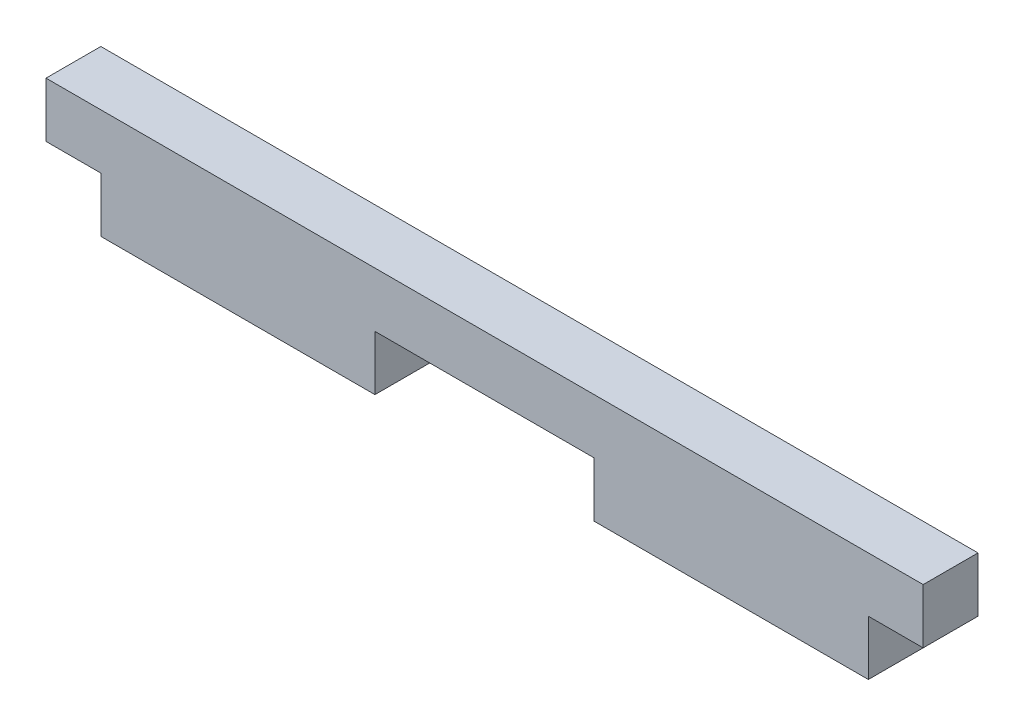
ISO-10303-21;
HEADER;
FILE_DESCRIPTION(('STEP AP214'),'2;1');
FILE_NAME('part.step','',(''),(''),'','','');
FILE_SCHEMA(('AUTOMOTIVE_DESIGN { 1 0 10303 214 1 1 1 1 }'));
ENDSEC;
DATA;
#1=APPLICATION_CONTEXT('core data for automotive mechanical design processes');
#2=APPLICATION_PROTOCOL_DEFINITION('international standard','automotive_design',2000,#1);
#3=PRODUCT_CONTEXT('',#1,'mechanical');
#4=PRODUCT('Part','Part','',(#3));
#5=PRODUCT_RELATED_PRODUCT_CATEGORY('part','',(#4));
#6=PRODUCT_DEFINITION_FORMATION('','',#4);
#7=PRODUCT_DEFINITION_CONTEXT('part definition',#1,'design');
#8=PRODUCT_DEFINITION('design','',#6,#7);
#9=PRODUCT_DEFINITION_SHAPE('','',#8);
#10=(LENGTH_UNIT() NAMED_UNIT(*) SI_UNIT(.MILLI.,.METRE.));
#11=(NAMED_UNIT(*) PLANE_ANGLE_UNIT() SI_UNIT($,.RADIAN.));
#12=(NAMED_UNIT(*) SI_UNIT($,.STERADIAN.) SOLID_ANGLE_UNIT());
#13=UNCERTAINTY_MEASURE_WITH_UNIT(LENGTH_MEASURE(1.E-05),#10,'distance_accuracy_value','');
#14=(GEOMETRIC_REPRESENTATION_CONTEXT(3) GLOBAL_UNCERTAINTY_ASSIGNED_CONTEXT((#13)) GLOBAL_UNIT_ASSIGNED_CONTEXT((#10,
#11,#12)) REPRESENTATION_CONTEXT('',''));
#15=CARTESIAN_POINT('',(0.,0.,0.));
#16=DIRECTION('',(0.,0.,1.));
#17=DIRECTION('',(1.,0.,0.));
#18=AXIS2_PLACEMENT_3D('',#15,#16,#17);
#19=CARTESIAN_POINT('',(0.,0.,5.));
#20=DIRECTION('',(1.,0.,0.));
#21=DIRECTION('',(0.,0.,-1.));
#22=AXIS2_PLACEMENT_3D('',#19,#20,#21);
#23=PLANE('',#22);
#24=DIRECTION('',(0.,-1.,0.));
#25=VECTOR('',#24,1.);
#26=CARTESIAN_POINT('',(0.,0.,0.));
#27=LINE('',#26,#25);
#28=CARTESIAN_POINT('',(0.,5.,0.));
#29=VERTEX_POINT('',#28);
#30=CARTESIAN_POINT('',(0.,0.,0.));
#31=VERTEX_POINT('',#30);
#32=EDGE_CURVE('E155',#29,#31,#27,.T.);
#33=ORIENTED_EDGE('',*,*,#32,.T.);
#34=DIRECTION('',(0.,0.,-1.));
#35=VECTOR('',#34,1.);
#36=CARTESIAN_POINT('',(0.,0.,5.));
#37=LINE('',#36,#35);
#38=CARTESIAN_POINT('',(0.,0.,5.));
#39=VERTEX_POINT('',#38);
#40=EDGE_CURVE('E11',#39,#31,#37,.T.);
#41=ORIENTED_EDGE('',*,*,#40,.F.);
#42=DIRECTION('',(0.,-1.,0.));
#43=VECTOR('',#42,1.);
#44=CARTESIAN_POINT('',(0.,0.,5.));
#45=LINE('',#44,#43);
#46=CARTESIAN_POINT('',(0.,5.,5.));
#47=VERTEX_POINT('',#46);
#48=EDGE_CURVE('E177',#47,#39,#45,.T.);
#49=ORIENTED_EDGE('',*,*,#48,.F.);
#50=DIRECTION('',(0.,0.,-1.));
#51=VECTOR('',#50,1.);
#52=CARTESIAN_POINT('',(0.,5.,5.));
#53=LINE('',#52,#51);
#54=EDGE_CURVE('E151',#47,#29,#53,.T.);
#55=ORIENTED_EDGE('',*,*,#54,.T.);
#56=EDGE_LOOP('',(#33,#41,#49,#55));
#57=FACE_BOUND('',#56,.T.);
#58=ADVANCED_FACE('F35',(#57),#23,.F.);
#59=CARTESIAN_POINT('',(0.,0.,5.));
#60=DIRECTION('',(0.,1.,0.));
#61=DIRECTION('',(0.,0.,1.));
#62=AXIS2_PLACEMENT_3D('',#59,#60,#61);
#63=PLANE('',#62);
#64=DIRECTION('',(1.,0.,0.));
#65=VECTOR('',#64,1.);
#66=CARTESIAN_POINT('',(0.,0.,0.));
#67=LINE('',#66,#65);
#68=CARTESIAN_POINT('',(5.,0.,0.));
#69=VERTEX_POINT('',#68);
#70=EDGE_CURVE('E158',#31,#69,#67,.T.);
#71=ORIENTED_EDGE('',*,*,#70,.T.);
#72=DIRECTION('',(0.,0.,-1.));
#73=VECTOR('',#72,1.);
#74=CARTESIAN_POINT('',(5.,0.,5.));
#75=LINE('',#74,#73);
#76=CARTESIAN_POINT('',(5.,0.,5.));
#77=VERTEX_POINT('',#76);
#78=EDGE_CURVE('E43',#77,#69,#75,.T.);
#79=ORIENTED_EDGE('',*,*,#78,.F.);
#80=DIRECTION('',(1.,0.,0.));
#81=VECTOR('',#80,1.);
#82=CARTESIAN_POINT('',(0.,0.,5.));
#83=LINE('',#82,#81);
#84=EDGE_CURVE('E106',#39,#77,#83,.T.);
#85=ORIENTED_EDGE('',*,*,#84,.F.);
#86=ORIENTED_EDGE('',*,*,#40,.T.);
#87=EDGE_LOOP('',(#71,#79,#85,#86));
#88=FACE_BOUND('',#87,.T.);
#89=ADVANCED_FACE('F255',(#88),#63,.F.);
#90=CARTESIAN_POINT('',(5.,0.,5.));
#91=DIRECTION('',(1.,0.,0.));
#92=DIRECTION('',(0.,0.,-1.));
#93=AXIS2_PLACEMENT_3D('',#90,#91,#92);
#94=PLANE('',#93);
#95=DIRECTION('',(0.,-1.,0.));
#96=VECTOR('',#95,1.);
#97=CARTESIAN_POINT('',(5.,0.,0.));
#98=LINE('',#97,#96);
#99=CARTESIAN_POINT('',(5.,-5.,0.));
#100=VERTEX_POINT('',#99);
#101=EDGE_CURVE('E160',#69,#100,#98,.T.);
#102=ORIENTED_EDGE('',*,*,#101,.T.);
#103=DIRECTION('',(0.,0.,-1.));
#104=VECTOR('',#103,1.);
#105=CARTESIAN_POINT('',(5.,-5.,5.));
#106=LINE('',#105,#104);
#107=CARTESIAN_POINT('',(5.,-5.,5.));
#108=VERTEX_POINT('',#107);
#109=EDGE_CURVE('E196',#108,#100,#106,.T.);
#110=ORIENTED_EDGE('',*,*,#109,.F.);
#111=DIRECTION('',(0.,-1.,0.));
#112=VECTOR('',#111,1.);
#113=CARTESIAN_POINT('',(5.,0.,5.));
#114=LINE('',#113,#112);
#115=EDGE_CURVE('E204',#77,#108,#114,.T.);
#116=ORIENTED_EDGE('',*,*,#115,.F.);
#117=ORIENTED_EDGE('',*,*,#78,.T.);
#118=EDGE_LOOP('',(#102,#110,#116,#117));
#119=FACE_BOUND('',#118,.T.);
#120=ADVANCED_FACE('F202',(#119),#94,.F.);
#121=CARTESIAN_POINT('',(5.,-5.,5.));
#122=DIRECTION('',(0.,1.,0.));
#123=DIRECTION('',(0.,0.,1.));
#124=AXIS2_PLACEMENT_3D('',#121,#122,#123);
#125=PLANE('',#124);
#126=DIRECTION('',(1.,0.,0.));
#127=VECTOR('',#126,1.);
#128=CARTESIAN_POINT('',(5.,-5.,0.));
#129=LINE('',#128,#127);
#130=CARTESIAN_POINT('',(30.,-5.,0.));
#131=VERTEX_POINT('',#130);
#132=EDGE_CURVE('E162',#100,#131,#129,.T.);
#133=ORIENTED_EDGE('',*,*,#132,.T.);
#134=DIRECTION('',(0.,0.,-1.));
#135=VECTOR('',#134,1.);
#136=CARTESIAN_POINT('',(30.,-5.,5.));
#137=LINE('',#136,#135);
#138=CARTESIAN_POINT('',(30.,-5.,5.));
#139=VERTEX_POINT('',#138);
#140=EDGE_CURVE('E193',#139,#131,#137,.T.);
#141=ORIENTED_EDGE('',*,*,#140,.F.);
#142=DIRECTION('',(1.,0.,0.));
#143=VECTOR('',#142,1.);
#144=CARTESIAN_POINT('',(5.,-5.,5.));
#145=LINE('',#144,#143);
#146=EDGE_CURVE('E222',#108,#139,#145,.T.);
#147=ORIENTED_EDGE('',*,*,#146,.F.);
#148=ORIENTED_EDGE('',*,*,#109,.T.);
#149=EDGE_LOOP('',(#133,#141,#147,#148));
#150=FACE_BOUND('',#149,.T.);
#151=ADVANCED_FACE('F213',(#150),#125,.F.);
#152=CARTESIAN_POINT('',(30.,0.,5.));
#153=DIRECTION('',(-1.,0.,0.));
#154=DIRECTION('',(0.,-1.,0.));
#155=AXIS2_PLACEMENT_3D('',#152,#153,#154);
#156=PLANE('',#155);
#157=DIRECTION('',(0.,1.,0.));
#158=VECTOR('',#157,1.);
#159=CARTESIAN_POINT('',(30.,0.,0.));
#160=LINE('',#159,#158);
#161=CARTESIAN_POINT('',(30.,0.,0.));
#162=VERTEX_POINT('',#161);
#163=EDGE_CURVE('E164',#131,#162,#160,.T.);
#164=ORIENTED_EDGE('',*,*,#163,.T.);
#165=DIRECTION('',(0.,0.,-1.));
#166=VECTOR('',#165,1.);
#167=CARTESIAN_POINT('',(30.,0.,5.));
#168=LINE('',#167,#166);
#169=CARTESIAN_POINT('',(30.,0.,5.));
#170=VERTEX_POINT('',#169);
#171=EDGE_CURVE('E190',#170,#162,#168,.T.);
#172=ORIENTED_EDGE('',*,*,#171,.F.);
#173=DIRECTION('',(0.,1.,0.));
#174=VECTOR('',#173,1.);
#175=CARTESIAN_POINT('',(30.,0.,5.));
#176=LINE('',#175,#174);
#177=EDGE_CURVE('E219',#139,#170,#176,.T.);
#178=ORIENTED_EDGE('',*,*,#177,.F.);
#179=ORIENTED_EDGE('',*,*,#140,.T.);
#180=EDGE_LOOP('',(#164,#172,#178,#179));
#181=FACE_BOUND('',#180,.T.);
#182=ADVANCED_FACE('F217',(#181),#156,.F.);
#183=CARTESIAN_POINT('',(30.,0.,5.));
#184=DIRECTION('',(0.,1.,0.));
#185=DIRECTION('',(0.,0.,1.));
#186=AXIS2_PLACEMENT_3D('',#183,#184,#185);
#187=PLANE('',#186);
#188=DIRECTION('',(1.,0.,0.));
#189=VECTOR('',#188,1.);
#190=CARTESIAN_POINT('',(30.,0.,0.));
#191=LINE('',#190,#189);
#192=CARTESIAN_POINT('',(50.,0.,0.));
#193=VERTEX_POINT('',#192);
#194=EDGE_CURVE('E166',#162,#193,#191,.T.);
#195=ORIENTED_EDGE('',*,*,#194,.T.);
#196=DIRECTION('',(0.,0.,-1.));
#197=VECTOR('',#196,1.);
#198=CARTESIAN_POINT('',(50.,0.,5.));
#199=LINE('',#198,#197);
#200=CARTESIAN_POINT('',(50.,0.,5.));
#201=VERTEX_POINT('',#200);
#202=EDGE_CURVE('E187',#201,#193,#199,.T.);
#203=ORIENTED_EDGE('',*,*,#202,.F.);
#204=DIRECTION('',(1.,0.,0.));
#205=VECTOR('',#204,1.);
#206=CARTESIAN_POINT('',(30.,0.,5.));
#207=LINE('',#206,#205);
#208=EDGE_CURVE('E221',#170,#201,#207,.T.);
#209=ORIENTED_EDGE('',*,*,#208,.F.);
#210=ORIENTED_EDGE('',*,*,#171,.T.);
#211=EDGE_LOOP('',(#195,#203,#209,#210));
#212=FACE_BOUND('',#211,.T.);
#213=ADVANCED_FACE('F268',(#212),#187,.F.);
#214=CARTESIAN_POINT('',(50.,0.,5.));
#215=DIRECTION('',(1.,0.,0.));
#216=DIRECTION('',(0.,0.,-1.));
#217=AXIS2_PLACEMENT_3D('',#214,#215,#216);
#218=PLANE('',#217);
#219=DIRECTION('',(0.,-1.,0.));
#220=VECTOR('',#219,1.);
#221=CARTESIAN_POINT('',(50.,0.,0.));
#222=LINE('',#221,#220);
#223=CARTESIAN_POINT('',(50.,-5.,0.));
#224=VERTEX_POINT('',#223);
#225=EDGE_CURVE('E168',#193,#224,#222,.T.);
#226=ORIENTED_EDGE('',*,*,#225,.T.);
#227=DIRECTION('',(0.,0.,-1.));
#228=VECTOR('',#227,1.);
#229=CARTESIAN_POINT('',(50.,-5.,5.));
#230=LINE('',#229,#228);
#231=CARTESIAN_POINT('',(50.,-5.,5.));
#232=VERTEX_POINT('',#231);
#233=EDGE_CURVE('E184',#232,#224,#230,.T.);
#234=ORIENTED_EDGE('',*,*,#233,.F.);
#235=DIRECTION('',(0.,-1.,0.));
#236=VECTOR('',#235,1.);
#237=CARTESIAN_POINT('',(50.,0.,5.));
#238=LINE('',#237,#236);
#239=EDGE_CURVE('E224',#201,#232,#238,.T.);
#240=ORIENTED_EDGE('',*,*,#239,.F.);
#241=ORIENTED_EDGE('',*,*,#202,.T.);
#242=EDGE_LOOP('',(#226,#234,#240,#241));
#243=FACE_BOUND('',#242,.T.);
#244=ADVANCED_FACE('F271',(#243),#218,.F.);
#245=CARTESIAN_POINT('',(75.,-5.,5.));
#246=DIRECTION('',(0.,1.,0.));
#247=DIRECTION('',(0.,0.,1.));
#248=AXIS2_PLACEMENT_3D('',#245,#246,#247);
#249=PLANE('',#248);
#250=DIRECTION('',(1.,0.,0.));
#251=VECTOR('',#250,1.);
#252=CARTESIAN_POINT('',(75.,-5.,0.));
#253=LINE('',#252,#251);
#254=CARTESIAN_POINT('',(75.,-5.,0.));
#255=VERTEX_POINT('',#254);
#256=EDGE_CURVE('E170',#224,#255,#253,.T.);
#257=ORIENTED_EDGE('',*,*,#256,.T.);
#258=DIRECTION('',(0.,0.,-1.));
#259=VECTOR('',#258,1.);
#260=CARTESIAN_POINT('',(75.,-5.,5.));
#261=LINE('',#260,#259);
#262=CARTESIAN_POINT('',(75.,-5.,5.));
#263=VERTEX_POINT('',#262);
#264=EDGE_CURVE('E181',#263,#255,#261,.T.);
#265=ORIENTED_EDGE('',*,*,#264,.F.);
#266=DIRECTION('',(1.,0.,0.));
#267=VECTOR('',#266,1.);
#268=CARTESIAN_POINT('',(75.,-5.,5.));
#269=LINE('',#268,#267);
#270=EDGE_CURVE('E230',#232,#263,#269,.T.);
#271=ORIENTED_EDGE('',*,*,#270,.F.);
#272=ORIENTED_EDGE('',*,*,#233,.T.);
#273=EDGE_LOOP('',(#257,#265,#271,#272));
#274=FACE_BOUND('',#273,.T.);
#275=ADVANCED_FACE('F236',(#274),#249,.F.);
#276=CARTESIAN_POINT('',(75.,0.,5.));
#277=DIRECTION('',(-1.,0.,0.));
#278=DIRECTION('',(0.,0.,1.));
#279=AXIS2_PLACEMENT_3D('',#276,#277,#278);
#280=PLANE('',#279);
#281=DIRECTION('',(0.,1.,0.));
#282=VECTOR('',#281,1.);
#283=CARTESIAN_POINT('',(75.,0.,0.));
#284=LINE('',#283,#282);
#285=CARTESIAN_POINT('',(75.,0.,0.));
#286=VERTEX_POINT('',#285);
#287=EDGE_CURVE('E172',#255,#286,#284,.T.);
#288=ORIENTED_EDGE('',*,*,#287,.T.);
#289=DIRECTION('',(0.,0.,-1.));
#290=VECTOR('',#289,1.);
#291=CARTESIAN_POINT('',(75.,0.,5.));
#292=LINE('',#291,#290);
#293=CARTESIAN_POINT('',(75.,0.,5.));
#294=VERTEX_POINT('',#293);
#295=EDGE_CURVE('E146',#294,#286,#292,.T.);
#296=ORIENTED_EDGE('',*,*,#295,.F.);
#297=DIRECTION('',(0.,1.,0.));
#298=VECTOR('',#297,1.);
#299=CARTESIAN_POINT('',(75.,0.,5.));
#300=LINE('',#299,#298);
#301=EDGE_CURVE('E137',#263,#294,#300,.T.);
#302=ORIENTED_EDGE('',*,*,#301,.F.);
#303=ORIENTED_EDGE('',*,*,#264,.T.);
#304=EDGE_LOOP('',(#288,#296,#302,#303));
#305=FACE_BOUND('',#304,.T.);
#306=ADVANCED_FACE('F240',(#305),#280,.F.);
#307=CARTESIAN_POINT('',(75.,0.,5.));
#308=DIRECTION('',(0.,1.,0.));
#309=DIRECTION('',(0.,0.,1.));
#310=AXIS2_PLACEMENT_3D('',#307,#308,#309);
#311=PLANE('',#310);
#312=DIRECTION('',(1.,0.,0.));
#313=VECTOR('',#312,1.);
#314=CARTESIAN_POINT('',(75.,0.,0.));
#315=LINE('',#314,#313);
#316=CARTESIAN_POINT('',(80.,0.,0.));
#317=VERTEX_POINT('',#316);
#318=EDGE_CURVE('E145',#286,#317,#315,.T.);
#319=ORIENTED_EDGE('',*,*,#318,.T.);
#320=DIRECTION('',(0.,0.,-1.));
#321=VECTOR('',#320,1.);
#322=CARTESIAN_POINT('',(80.,0.,5.));
#323=LINE('',#322,#321);
#324=CARTESIAN_POINT('',(80.,0.,5.));
#325=VERTEX_POINT('',#324);
#326=EDGE_CURVE('E142',#325,#317,#323,.T.);
#327=ORIENTED_EDGE('',*,*,#326,.F.);
#328=DIRECTION('',(1.,0.,0.));
#329=VECTOR('',#328,1.);
#330=CARTESIAN_POINT('',(75.,0.,5.));
#331=LINE('',#330,#329);
#332=EDGE_CURVE('E131',#294,#325,#331,.T.);
#333=ORIENTED_EDGE('',*,*,#332,.F.);
#334=ORIENTED_EDGE('',*,*,#295,.T.);
#335=EDGE_LOOP('',(#319,#327,#333,#334));
#336=FACE_BOUND('',#335,.T.);
#337=ADVANCED_FACE('F143',(#336),#311,.F.);
#338=CARTESIAN_POINT('',(80.,0.,5.));
#339=DIRECTION('',(-1.,0.,0.));
#340=DIRECTION('',(0.,0.,1.));
#341=AXIS2_PLACEMENT_3D('',#338,#339,#340);
#342=PLANE('',#341);
#343=DIRECTION('',(0.,1.,0.));
#344=VECTOR('',#343,1.);
#345=CARTESIAN_POINT('',(80.,0.,0.));
#346=LINE('',#345,#344);
#347=CARTESIAN_POINT('',(80.,5.,0.));
#348=VERTEX_POINT('',#347);
#349=EDGE_CURVE('E92',#317,#348,#346,.T.);
#350=ORIENTED_EDGE('',*,*,#349,.T.);
#351=DIRECTION('',(0.,0.,-1.));
#352=VECTOR('',#351,1.);
#353=CARTESIAN_POINT('',(80.,5.,5.));
#354=LINE('',#353,#352);
#355=CARTESIAN_POINT('',(80.,5.,5.));
#356=VERTEX_POINT('',#355);
#357=EDGE_CURVE('E147',#356,#348,#354,.T.);
#358=ORIENTED_EDGE('',*,*,#357,.F.);
#359=DIRECTION('',(0.,1.,0.));
#360=VECTOR('',#359,1.);
#361=CARTESIAN_POINT('',(80.,0.,5.));
#362=LINE('',#361,#360);
#363=EDGE_CURVE('E135',#325,#356,#362,.T.);
#364=ORIENTED_EDGE('',*,*,#363,.F.);
#365=ORIENTED_EDGE('',*,*,#326,.T.);
#366=EDGE_LOOP('',(#350,#358,#364,#365));
#367=FACE_BOUND('',#366,.T.);
#368=ADVANCED_FACE('F149',(#367),#342,.F.);
#369=CARTESIAN_POINT('',(0.,5.,5.));
#370=DIRECTION('',(0.,-1.,0.));
#371=DIRECTION('',(0.,0.,-1.));
#372=AXIS2_PLACEMENT_3D('',#369,#370,#371);
#373=PLANE('',#372);
#374=DIRECTION('',(-1.,0.,0.));
#375=VECTOR('',#374,1.);
#376=CARTESIAN_POINT('',(0.,5.,0.));
#377=LINE('',#376,#375);
#378=EDGE_CURVE('E98',#348,#29,#377,.T.);
#379=ORIENTED_EDGE('',*,*,#378,.T.);
#380=ORIENTED_EDGE('',*,*,#54,.F.);
#381=DIRECTION('',(-1.,0.,0.));
#382=VECTOR('',#381,1.);
#383=CARTESIAN_POINT('',(0.,5.,5.));
#384=LINE('',#383,#382);
#385=EDGE_CURVE('E51',#356,#47,#384,.T.);
#386=ORIENTED_EDGE('',*,*,#385,.F.);
#387=ORIENTED_EDGE('',*,*,#357,.T.);
#388=EDGE_LOOP('',(#379,#380,#386,#387));
#389=FACE_BOUND('',#388,.T.);
#390=ADVANCED_FACE('F244',(#389),#373,.F.);
#391=CARTESIAN_POINT('',(0.,0.,5.));
#392=DIRECTION('',(0.,0.,-1.));
#393=DIRECTION('',(-1.,0.,0.));
#394=AXIS2_PLACEMENT_3D('',#391,#392,#393);
#395=PLANE('',#394);
#396=ORIENTED_EDGE('',*,*,#48,.T.);
#397=ORIENTED_EDGE('',*,*,#84,.T.);
#398=ORIENTED_EDGE('',*,*,#115,.T.);
#399=ORIENTED_EDGE('',*,*,#146,.T.);
#400=ORIENTED_EDGE('',*,*,#177,.T.);
#401=ORIENTED_EDGE('',*,*,#208,.T.);
#402=ORIENTED_EDGE('',*,*,#239,.T.);
#403=ORIENTED_EDGE('',*,*,#270,.T.);
#404=ORIENTED_EDGE('',*,*,#301,.T.);
#405=ORIENTED_EDGE('',*,*,#332,.T.);
#406=ORIENTED_EDGE('',*,*,#363,.T.);
#407=ORIENTED_EDGE('',*,*,#385,.T.);
#408=EDGE_LOOP('',(#396,#397,#398,#399,#400,#401,#402,#403,#404,#405,#406,#407));
#409=FACE_BOUND('',#408,.T.);
#410=ADVANCED_FACE('F133',(#409),#395,.F.);
#411=CARTESIAN_POINT('',(0.,0.,0.));
#412=DIRECTION('',(0.,0.,-1.));
#413=DIRECTION('',(-1.,0.,0.));
#414=AXIS2_PLACEMENT_3D('',#411,#412,#413);
#415=PLANE('',#414);
#416=ORIENTED_EDGE('',*,*,#32,.F.);
#417=ORIENTED_EDGE('',*,*,#378,.F.);
#418=ORIENTED_EDGE('',*,*,#349,.F.);
#419=ORIENTED_EDGE('',*,*,#318,.F.);
#420=ORIENTED_EDGE('',*,*,#287,.F.);
#421=ORIENTED_EDGE('',*,*,#256,.F.);
#422=ORIENTED_EDGE('',*,*,#225,.F.);
#423=ORIENTED_EDGE('',*,*,#194,.F.);
#424=ORIENTED_EDGE('',*,*,#163,.F.);
#425=ORIENTED_EDGE('',*,*,#132,.F.);
#426=ORIENTED_EDGE('',*,*,#101,.F.);
#427=ORIENTED_EDGE('',*,*,#70,.F.);
#428=EDGE_LOOP('',(#416,#417,#418,#419,#420,#421,#422,#423,#424,#425,#426,#427));
#429=FACE_BOUND('',#428,.T.);
#430=ADVANCED_FACE('F208',(#429),#415,.T.);
#431=CLOSED_SHELL('',(#58,#89,#120,#151,#182,#213,#244,#275,#306,#337,#368,#390,#410,#430));
#432=MANIFOLD_SOLID_BREP('B2',#431);
#433=ADVANCED_BREP_SHAPE_REPRESENTATION('',(#18,#432),#14);
#434=SHAPE_DEFINITION_REPRESENTATION(#9,#433);
ENDSEC;
END-ISO-10303-21;
